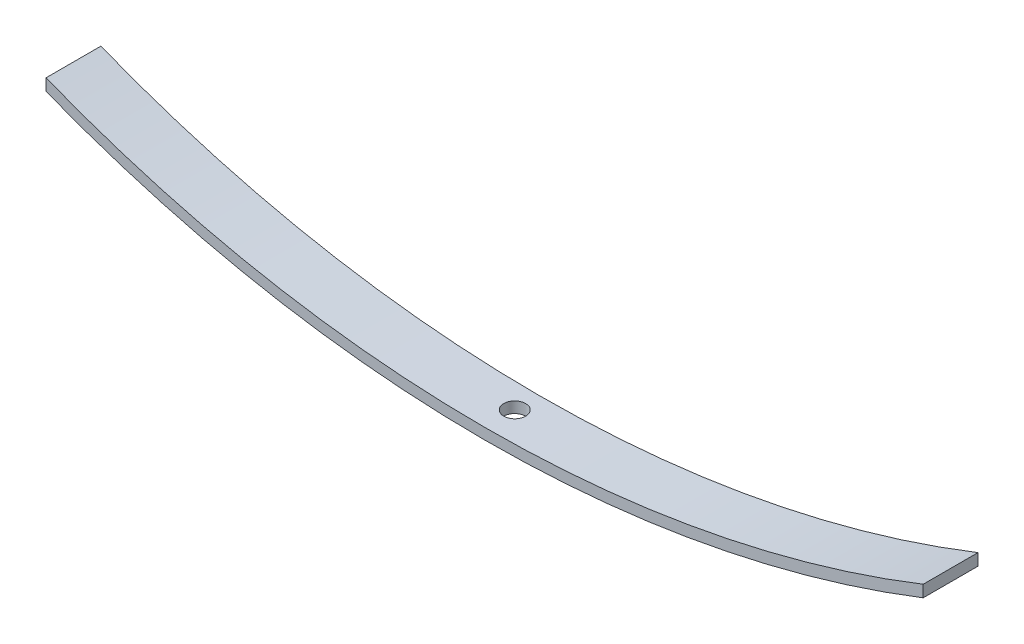
ISO-10303-21;
HEADER;
FILE_DESCRIPTION(('STEP AP214'),'2;1');
FILE_NAME('part.step','',(''),(''),'','','');
FILE_SCHEMA(('AUTOMOTIVE_DESIGN { 1 0 10303 214 1 1 1 1 }'));
ENDSEC;
DATA;
#1=APPLICATION_CONTEXT('core data for automotive mechanical design processes');
#2=APPLICATION_PROTOCOL_DEFINITION('international standard','automotive_design',2000,#1);
#3=PRODUCT_CONTEXT('',#1,'mechanical');
#4=PRODUCT('Part','Part','',(#3));
#5=PRODUCT_RELATED_PRODUCT_CATEGORY('part','',(#4));
#6=PRODUCT_DEFINITION_FORMATION('','',#4);
#7=PRODUCT_DEFINITION_CONTEXT('part definition',#1,'design');
#8=PRODUCT_DEFINITION('design','',#6,#7);
#9=PRODUCT_DEFINITION_SHAPE('','',#8);
#10=(LENGTH_UNIT() NAMED_UNIT(*) SI_UNIT(.MILLI.,.METRE.));
#11=(NAMED_UNIT(*) PLANE_ANGLE_UNIT() SI_UNIT($,.RADIAN.));
#12=(NAMED_UNIT(*) SI_UNIT($,.STERADIAN.) SOLID_ANGLE_UNIT());
#13=UNCERTAINTY_MEASURE_WITH_UNIT(LENGTH_MEASURE(1.E-05),#10,'distance_accuracy_value','');
#14=(GEOMETRIC_REPRESENTATION_CONTEXT(3) GLOBAL_UNCERTAINTY_ASSIGNED_CONTEXT((#13)) GLOBAL_UNIT_ASSIGNED_CONTEXT((#10,
#11,#12)) REPRESENTATION_CONTEXT('',''));
#15=CARTESIAN_POINT('',(0.,0.,0.));
#16=DIRECTION('',(0.,0.,1.));
#17=DIRECTION('',(1.,0.,0.));
#18=AXIS2_PLACEMENT_3D('',#15,#16,#17);
#19=CARTESIAN_POINT('',(-400.,-1024.69507659596,50.));
#20=DIRECTION('',(-1.,0.,0.));
#21=DIRECTION('',(0.,0.,1.));
#22=AXIS2_PLACEMENT_3D('',#19,#20,#21);
#23=PLANE('',#22);
#24=DIRECTION('',(0.,1.,0.));
#25=VECTOR('',#24,1.);
#26=CARTESIAN_POINT('',(-400.,-1024.69507659596,0.));
#27=LINE('',#26,#25);
#28=CARTESIAN_POINT('',(-400.,-1024.69507659596,0.));
#29=VERTEX_POINT('',#28);
#30=CARTESIAN_POINT('',(-400.,-1013.9526616169,0.));
#31=VERTEX_POINT('',#30);
#32=EDGE_CURVE('E117',#29,#31,#27,.T.);
#33=ORIENTED_EDGE('',*,*,#32,.F.);
#34=DIRECTION('',(0.,0.,-1.));
#35=VECTOR('',#34,1.);
#36=CARTESIAN_POINT('',(-400.,-1024.69507659596,50.));
#37=LINE('',#36,#35);
#38=CARTESIAN_POINT('',(-400.,-1024.69507659596,50.));
#39=VERTEX_POINT('',#38);
#40=EDGE_CURVE('E11',#39,#29,#37,.T.);
#41=ORIENTED_EDGE('',*,*,#40,.F.);
#42=DIRECTION('',(0.,1.,0.));
#43=VECTOR('',#42,1.);
#44=CARTESIAN_POINT('',(-400.,-1024.69507659596,50.));
#45=LINE('',#44,#43);
#46=CARTESIAN_POINT('',(-400.,-1013.9526616169,50.));
#47=VERTEX_POINT('',#46);
#48=EDGE_CURVE('E109',#39,#47,#45,.T.);
#49=ORIENTED_EDGE('',*,*,#48,.T.);
#50=DIRECTION('',(0.,0.,-1.));
#51=VECTOR('',#50,1.);
#52=CARTESIAN_POINT('',(-400.,-1013.9526616169,50.));
#53=LINE('',#52,#51);
#54=EDGE_CURVE('E85',#47,#31,#53,.T.);
#55=ORIENTED_EDGE('',*,*,#54,.T.);
#56=EDGE_LOOP('',(#33,#41,#49,#55));
#57=FACE_BOUND('',#56,.T.);
#58=ADVANCED_FACE('F39',(#57),#23,.T.);
#59=CARTESIAN_POINT('',(0.,0.,50.));
#60=DIRECTION('',(0.,0.,-1.));
#61=DIRECTION('',(-1.,0.,0.));
#62=AXIS2_PLACEMENT_3D('',#59,#60,#61);
#63=CYLINDRICAL_SURFACE('',#62,1100.);
#64=CARTESIAN_POINT('',(0.,-1100.,32.5));
#65=CARTESIAN_POINT('',(0.280947064307973,-1100.00000005117,32.5000020216511));
#66=CARTESIAN_POINT('',(0.561860972590403,-1099.99989213973,32.4881554478381));
#67=CARTESIAN_POINT('',(1.12178578051435,-1099.99946361781,32.4408518933722));
#68=CARTESIAN_POINT('',(1.40079616039585,-1099.99914295142,32.405388705864));
#69=CARTESIAN_POINT('',(1.95513034684573,-1099.99829744652,32.3110449823883));
#70=CARTESIAN_POINT('',(2.23044990980033,-1099.99777239089,32.2521395419737));
#71=CARTESIAN_POINT('',(2.7751497667588,-1099.99653304989,32.1113304951339));
#72=CARTESIAN_POINT('',(3.04452995547942,-1099.99581876118,32.0294264813815));
#73=CARTESIAN_POINT('',(3.57529527460837,-1099.99422165126,31.8432499038494));
#74=CARTESIAN_POINT('',(3.83668430405865,-1099.99333891383,31.738988454337));
#75=CARTESIAN_POINT('',(4.34975280879096,-1099.99142972603,31.5088127117588));
#76=CARTESIAN_POINT('',(4.60143213081407,-1099.9904032734,31.3828980770881));
#77=CARTESIAN_POINT('',(5.0932266343026,-1099.9882360755,31.1103460883793));
#78=CARTESIAN_POINT('',(5.33334464279631,-1099.9870953584,30.9637138351722));
#79=CARTESIAN_POINT('',(5.80037129075108,-1099.98473181792,30.6507488257479));
#80=CARTESIAN_POINT('',(6.02728021159513,-1099.9835089963,30.4844164894155));
#81=CARTESIAN_POINT('',(6.46631265262179,-1099.9810157489,30.1332061640088));
#82=CARTESIAN_POINT('',(6.67843408632362,-1099.97974531645,29.9483255667576));
#83=CARTESIAN_POINT('',(7.08634881654811,-1099.97719306931,29.5613522944773));
#84=CARTESIAN_POINT('',(7.2821420962676,-1099.97591125461,29.359259601736));
#85=CARTESIAN_POINT('',(7.65601579250191,-1099.97337257883,28.9392906534728));
#86=CARTESIAN_POINT('',(7.83409551840596,-1099.97211571873,28.7214137831341));
#87=CARTESIAN_POINT('',(8.17126738505734,-1099.96966268322,28.2714323481411));
#88=CARTESIAN_POINT('',(8.33035952943423,-1099.9684665078,28.0393277862065));
#89=CARTESIAN_POINT('',(8.6284250166648,-1099.96616879997,27.5625412338764));
#90=CARTESIAN_POINT('',(8.76739838401762,-1099.96506726744,27.3178592587974));
#91=CARTESIAN_POINT('',(9.02423845245466,-1099.96299011505,26.8176570746719));
#92=CARTESIAN_POINT('',(9.14210515282945,-1099.96201449518,26.5621368652612));
#93=CARTESIAN_POINT('',(9.35589356320991,-1099.96021686752,26.0420753556994));
#94=CARTESIAN_POINT('',(9.45181532069158,-1099.9593948594,25.7775340750661));
#95=CARTESIAN_POINT('',(9.6210320783027,-1099.95792778982,25.2413106724479));
#96=CARTESIAN_POINT('',(9.69432707912008,-1099.95728272837,24.9696285506802));
#97=CARTESIAN_POINT('',(9.81776748787596,-1099.95618788033,24.4210622387808));
#98=CARTESIAN_POINT('',(9.86791350030773,-1099.95573808865,24.1441781846845));
#99=CARTESIAN_POINT('',(9.94470215047097,-1099.95504652537,23.5871696647333));
#100=CARTESIAN_POINT('',(9.97134478860151,-1099.95480475378,23.3070451989335));
#101=CARTESIAN_POINT('',(10.0009371907584,-1099.95453609485,22.7455480448875));
#102=CARTESIAN_POINT('',(10.003887001745,-1099.95450920708,22.4641753591165));
#103=CARTESIAN_POINT('',(9.98607289476243,-1099.95467107818,21.9021817319619));
#104=CARTESIAN_POINT('',(9.965308977192,-1099.95485983704,21.6215607905655));
#105=CARTESIAN_POINT('',(9.90021603221038,-1099.95544763372,21.063073989674));
#106=CARTESIAN_POINT('',(9.85588769419265,-1099.95584666539,20.7852080498216));
#107=CARTESIAN_POINT('',(9.74398155305454,-1099.95684367609,20.2341983398215));
#108=CARTESIAN_POINT('',(9.67640375043628,-1099.95744165513,19.9610545695718));
#109=CARTESIAN_POINT('',(9.51847911119723,-1099.95881958582,19.421430683837));
#110=CARTESIAN_POINT('',(9.42813224886001,-1099.95959953768,19.1549505758786));
#111=CARTESIAN_POINT('',(9.22531191308742,-1099.96131927302,18.6305486862249));
#112=CARTESIAN_POINT('',(9.11283843914294,-1099.9622590565,18.3726269047267));
#113=CARTESIAN_POINT('',(8.86656272873204,-1099.96427179258,17.8671714055499));
#114=CARTESIAN_POINT('',(8.73276017902452,-1099.96534474714,17.6196378405013));
#115=CARTESIAN_POINT('',(8.44477876718316,-1099.96759335706,17.1367223888157));
#116=CARTESIAN_POINT('',(8.29059990492967,-1099.96876901242,16.9013405022501));
#117=CARTESIAN_POINT('',(7.96296196272636,-1099.97118965167,16.4444016228667));
#118=CARTESIAN_POINT('',(7.78950288654837,-1099.97243463555,16.2228446273443));
#119=CARTESIAN_POINT('',(7.42453755271911,-1099.97495859309,15.7951303567988));
#120=CARTESIAN_POINT('',(7.23303129461007,-1099.97623756676,15.5889730821661));
#121=CARTESIAN_POINT('',(6.83332562771209,-1099.97879324704,15.1935164840785));
#122=CARTESIAN_POINT('',(6.62512561226872,-1099.98006995357,15.0042177737951));
#123=CARTESIAN_POINT('',(6.19351853340997,-1099.98258481179,14.6438324390783));
#124=CARTESIAN_POINT('',(5.97011146959816,-1099.98382296348,14.4727458151196));
#125=CARTESIAN_POINT('',(5.50967840926728,-1099.98622556548,14.1500009250355));
#126=CARTESIAN_POINT('',(5.27265241071586,-1099.98739001578,13.9983426618094));
#127=CARTESIAN_POINT('',(4.7866664993514,-1099.98961216017,13.7155327561576));
#128=CARTESIAN_POINT('',(4.5377065866729,-1099.99066985426,13.5843811135007));
#129=CARTESIAN_POINT('',(4.02962249751724,-1099.99264846258,13.3435168404398));
#130=CARTESIAN_POINT('',(3.77049831242723,-1099.99356937668,13.2338042282029));
#131=CARTESIAN_POINT('',(3.24392807012183,-1099.99524828184,13.0365982714823));
#132=CARTESIAN_POINT('',(2.9764820128677,-1099.99600627289,12.9491049271019));
#133=CARTESIAN_POINT('',(2.43516952517331,-1099.99733781424,12.7969596925449));
#134=CARTESIAN_POINT('',(2.16130309631317,-1099.9979113646,12.7323077967468));
#135=CARTESIAN_POINT('',(1.60909695182085,-1099.99885774291,12.6263051983335));
#136=CARTESIAN_POINT('',(1.33075723632501,-1099.99923057088,12.5849544950081));
#137=CARTESIAN_POINT('',(0.771593545451839,-1099.99976491098,12.5258494128803));
#138=CARTESIAN_POINT('',(0.490769659433458,-1099.99992643068,12.5080941887633));
#139=CARTESIAN_POINT('',(-0.0713756577629724,-1100.00003359402,12.4963035779614));
#140=CARTESIAN_POINT('',(-0.352697088929224,-1099.99997923768,12.5022681907142));
#141=CARTESIAN_POINT('',(-0.913837378686011,-1099.99965619194,12.5378748347896));
#142=CARTESIAN_POINT('',(-1.19365623736931,-1099.99938750255,12.5675168646504));
#143=CARTESIAN_POINT('',(-1.74980200235998,-1099.99864341784,12.6502675468223));
#144=CARTESIAN_POINT('',(-2.02612890867426,-1099.99816802251,12.7033761990869));
#145=CARTESIAN_POINT('',(-2.57332170066523,-1099.99702402999,12.832681392134));
#146=CARTESIAN_POINT('',(-2.84418767679329,-1099.996355436,12.9088775501743));
#147=CARTESIAN_POINT('',(-3.37853774997116,-1099.994844021,13.083816268699));
#148=CARTESIAN_POINT('',(-3.64202184713313,-1099.99400119998,13.1825588288409));
#149=CARTESIAN_POINT('',(-4.15973514308947,-1099.99216525379,13.4018882914459));
#150=CARTESIAN_POINT('',(-4.4139643416674,-1099.99117212861,13.52247519442));
#151=CARTESIAN_POINT('',(-4.91136066858346,-1099.98906376295,13.7846360235526));
#152=CARTESIAN_POINT('',(-5.15452779659761,-1099.98794852246,13.9262099503258));
#153=CARTESIAN_POINT('',(-5.62807822212533,-1099.98562754781,14.2293426724206));
#154=CARTESIAN_POINT('',(-5.85846115650697,-1099.98442181108,14.3909020350031));
#155=CARTESIAN_POINT('',(-6.3047980722711,-1099.98195409673,14.7328539213465));
#156=CARTESIAN_POINT('',(-6.52075205340541,-1099.98069211911,14.9132464454312));
#157=CARTESIAN_POINT('',(-6.93669609007042,-1099.97814774351,15.2915824009235));
#158=CARTESIAN_POINT('',(-7.1366861363515,-1099.97686534553,15.4895258425001));
#159=CARTESIAN_POINT('',(-7.5192805340355,-1099.97431653123,15.9015564578257));
#160=CARTESIAN_POINT('',(-7.70188488516435,-1099.97305011491,16.1156436318292));
#161=CARTESIAN_POINT('',(-8.04841491977836,-1099.97056917538,16.5584464198348));
#162=CARTESIAN_POINT('',(-8.21234005256345,-1099.96935465371,16.7871624648145));
#163=CARTESIAN_POINT('',(-8.52034002029632,-1099.96701202092,17.2575914138369));
#164=CARTESIAN_POINT('',(-8.66441485480448,-1099.96588390981,17.4993043181674));
#165=CARTESIAN_POINT('',(-8.93168971938829,-1099.96374612479,17.9940083611056));
#166=CARTESIAN_POINT('',(-9.0548897731304,-1099.96273645075,18.2469994869264));
#167=CARTESIAN_POINT('',(-9.27953928096262,-1099.96086420252,18.7624616538708));
#168=CARTESIAN_POINT('',(-9.38098873558057,-1099.96000162833,19.0249326947644));
#169=CARTESIAN_POINT('',(-9.56141420827453,-1099.95844808083,19.5574843714006));
#170=CARTESIAN_POINT('',(-9.6403905882246,-1099.95775710476,19.8275648845344));
#171=CARTESIAN_POINT('',(-9.77531048728018,-1099.95656635235,20.3734194094439));
#172=CARTESIAN_POINT('',(-9.8312540065221,-1099.95606657601,20.6491934211859));
#173=CARTESIAN_POINT('',(-9.91971041816975,-1099.95527241126,21.2044746995368));
#174=CARTESIAN_POINT('',(-9.95222327318557,-1099.95497802318,21.4839819721024));
#175=CARTESIAN_POINT('',(-9.9935869887929,-1099.95460299441,22.044742053393));
#176=CARTESIAN_POINT('',(-10.0024378499717,-1099.95452235372,22.3259948620747));
#177=CARTESIAN_POINT('',(-9.99641474966445,-1099.95457710805,22.8882356169393));
#178=CARTESIAN_POINT('',(-9.98154168886788,-1099.95471249489,23.1692235727723));
#179=CARTESIAN_POINT('',(-9.92817819983436,-1099.95519544543,23.7289476401099));
#180=CARTESIAN_POINT('',(-9.8896877721794,-1099.95554300913,24.00768375167));
#181=CARTESIAN_POINT('',(-9.78936315775909,-1099.95644044724,24.5609230488737));
#182=CARTESIAN_POINT('',(-9.72752892421368,-1099.95699032205,24.8354262260335));
#183=CARTESIAN_POINT('',(-9.58095639853485,-1099.95827677224,25.378247578608));
#184=CARTESIAN_POINT('',(-9.49621810655042,-1099.95901334763,25.6465657540628));
#185=CARTESIAN_POINT('',(-9.304438217086,-1099.96065230423,26.1751145228585));
#186=CARTESIAN_POINT('',(-9.19739620805113,-1099.96155468852,26.4353449668601));
#187=CARTESIAN_POINT('',(-8.96177089994736,-1099.96349963719,26.9458631765871));
#188=CARTESIAN_POINT('',(-8.8331875967543,-1099.9645422016,27.1961509404087));
#189=CARTESIAN_POINT('',(-8.55539929002957,-1099.96673787208,27.684995049854));
#190=CARTESIAN_POINT('',(-8.40619508437191,-1099.96789097387,27.9235518488939));
#191=CARTESIAN_POINT('',(-8.08822199569385,-1099.97027502198,28.3872485290119));
#192=CARTESIAN_POINT('',(-7.91945313189211,-1099.97150596823,28.6123884232693));
#193=CARTESIAN_POINT('',(-7.56356432748525,-1099.97401066856,29.0476341025049));
#194=CARTESIAN_POINT('',(-7.37644583567259,-1099.97528441926,29.2577410721438));
#195=CARTESIAN_POINT('',(-6.98517229922889,-1099.97783870054,29.6614515965173));
#196=CARTESIAN_POINT('',(-6.78101689079579,-1099.97911923127,29.855054798656));
#197=CARTESIAN_POINT('',(-6.35707164122872,-1099.98165101663,30.2244223053224));
#198=CARTESIAN_POINT('',(-6.13727796443782,-1099.98290226398,30.400182207524));
#199=CARTESIAN_POINT('',(-5.68366731250256,-1099.9853396097,30.7325563312236));
#200=CARTESIAN_POINT('',(-5.44985055868444,-1099.98652570909,30.8891708547745));
#201=CARTESIAN_POINT('',(-4.96972995606513,-1099.98879968479,31.1822187171478));
#202=CARTESIAN_POINT('',(-4.7234197905025,-1099.98988751061,31.3186417076206));
#203=CARTESIAN_POINT('',(-4.22018163412486,-1099.99193332191,31.5702373393554));
#204=CARTESIAN_POINT('',(-3.96325383145126,-1099.99289130968,31.6854103569634));
#205=CARTESIAN_POINT('',(-3.44087746622745,-1099.99464930056,31.8935788467592));
#206=CARTESIAN_POINT('',(-3.17543826339022,-1099.99544947072,31.9865977921384));
#207=CARTESIAN_POINT('',(-2.63775802567634,-1099.99687023153,32.1499313837608));
#208=CARTESIAN_POINT('',(-2.36551879736234,-1099.99749086934,32.2202519925835));
#209=CARTESIAN_POINT('',(-1.7475100578521,-1099.99866540734,32.3523789407716));
#210=CARTESIAN_POINT('',(-1.40033267948958,-1099.99916407617,32.4076898095124));
#211=CARTESIAN_POINT('',(-0.702086281630147,-1099.99983134053,32.4814990757067));
#212=CARTESIAN_POINT('',(-0.351017262236259,-1099.99999993607,32.4999974741347));
#213=CARTESIAN_POINT('',(0.,-1100.,32.5));
#214=B_SPLINE_CURVE_WITH_KNOTS('',3,(#64,#65,#66,#67,#68,#69,#70,#71,#72,#73,#74,#75,#76,#77,
#78,#79,#80,#81,#82,#83,#84,#85,#86,#87,#88,#89,#90,#91,#92,#93,#94,#95,#96,#97,#98,#99,#100,
#101,#102,#103,#104,#105,#106,#107,#108,#109,#110,#111,#112,#113,#114,#115,#116,#117,#118,#119,
#120,#121,#122,#123,#124,#125,#126,#127,#128,#129,#130,#131,#132,#133,#134,#135,#136,#137,#138,
#139,#140,#141,#142,#143,#144,#145,#146,#147,#148,#149,#150,#151,#152,#153,#154,#155,#156,#157,
#158,#159,#160,#161,#162,#163,#164,#165,#166,#167,#168,#169,#170,#171,#172,#173,#174,#175,#176,
#177,#178,#179,#180,#181,#182,#183,#184,#185,#186,#187,#188,#189,#190,#191,#192,#193,#194,#195,
#196,#197,#198,#199,#200,#201,#202,#203,#204,#205,#206,#207,#208,#209,#210,#211,#212,#213),
.UNSPECIFIED.,.T.,.F.,(4,2,2,2,2,2,2,2,2,2,2,2,2,2,2,2,2,2,2,2,2,2,2,2,2,2,2,2,2,2,2,2,2,2,2,2,
2,2,2,2,2,2,2,2,2,2,2,2,2,2,2,2,2,2,2,2,2,2,2,2,2,2,2,2,2,2,2,2,2,2,2,2,2,2,4),(0.,
0.842534577510601,1.68529067514222,2.5289444955584,3.37261325884719,4.21586358809915,
5.0591272218507,5.90218359847124,6.74522200953625,7.58837913164906,8.43153712143766,
9.27472797114516,10.1179186596733,10.9611083214188,11.8042980115051,12.6474858774049,
13.4906737176693,14.3338395383882,15.1770053447907,16.020169479999,16.8633336010304,
17.7064730560677,18.5496124928953,19.3927528820083,20.2358932905217,21.079046082627,
21.9221988796832,22.7653515117916,23.6085041652863,24.4516874730138,25.2948708027221,
26.1380542582581,26.9812377042883,27.8244218648185,28.667606029274,29.5107899862167,
30.3539739174617,31.1971276405931,32.0402813437306,32.8834349948124,33.7265886442239,
34.5697283166834,35.4128679763346,36.2560076557052,37.0991473597693,37.9423110007654,
38.7854746562632,39.6286388002934,40.4718029576155,41.314991966646,42.15818099435,
43.001369066095,43.8445571173779,44.6877315904048,45.5309060584382,46.3740818719793,
47.2172576645916,48.0604014464112,48.9035452074536,49.7466906581313,50.5898361033245,
51.4329971078685,52.2761582738391,53.1192868249362,53.9624145478228,54.8054757551859,
55.6485549696765,56.491841687007,57.3351150982441,58.1788192094785,59.0225083769307,
59.865299602535,60.7078692565258,61.7605379836224,62.813206682851),.UNSPECIFIED.);
#215=CARTESIAN_POINT('',(0.,-1100.,32.5));
#216=VERTEX_POINT('',#215);
#217=EDGE_CURVE('E122',#216,#216,#214,.T.);
#218=ORIENTED_EDGE('',*,*,#217,.T.);
#219=EDGE_LOOP('',(#218));
#220=FACE_BOUND('',#219,.T.);
#221=CARTESIAN_POINT('',(0.,0.,0.));
#222=DIRECTION('',(0.,0.,1.));
#223=DIRECTION('',(1.,0.,0.));
#224=AXIS2_PLACEMENT_3D('',#221,#222,#223);
#225=CIRCLE('',#224,1100.);
#226=CARTESIAN_POINT('',(400.,-1024.69507659596,0.));
#227=VERTEX_POINT('',#226);
#228=EDGE_CURVE('E77',#29,#227,#225,.T.);
#229=ORIENTED_EDGE('',*,*,#228,.T.);
#230=DIRECTION('',(0.,0.,-1.));
#231=VECTOR('',#230,1.);
#232=CARTESIAN_POINT('',(400.,-1024.69507659596,50.));
#233=LINE('',#232,#231);
#234=CARTESIAN_POINT('',(400.,-1024.69507659596,50.));
#235=VERTEX_POINT('',#234);
#236=EDGE_CURVE('E53',#235,#227,#233,.T.);
#237=ORIENTED_EDGE('',*,*,#236,.F.);
#238=CARTESIAN_POINT('',(0.,0.,50.));
#239=DIRECTION('',(0.,0.,1.));
#240=DIRECTION('',(1.,0.,0.));
#241=AXIS2_PLACEMENT_3D('',#238,#239,#240);
#242=CIRCLE('',#241,1100.);
#243=EDGE_CURVE('E95',#39,#235,#242,.T.);
#244=ORIENTED_EDGE('',*,*,#243,.F.);
#245=ORIENTED_EDGE('',*,*,#40,.T.);
#246=EDGE_LOOP('',(#229,#237,#244,#245));
#247=FACE_BOUND('',#246,.T.);
#248=ADVANCED_FACE('F144',(#220,#247),#63,.T.);
#249=CARTESIAN_POINT('',(400.,-1024.69507659596,50.));
#250=DIRECTION('',(-1.,0.,0.));
#251=DIRECTION('',(0.,0.,1.));
#252=AXIS2_PLACEMENT_3D('',#249,#250,#251);
#253=PLANE('',#252);
#254=DIRECTION('',(0.,1.,0.));
#255=VECTOR('',#254,1.);
#256=CARTESIAN_POINT('',(400.,-1024.69507659596,0.));
#257=LINE('',#256,#255);
#258=CARTESIAN_POINT('',(400.,-1013.9526616169,0.));
#259=VERTEX_POINT('',#258);
#260=EDGE_CURVE('E103',#227,#259,#257,.T.);
#261=ORIENTED_EDGE('',*,*,#260,.T.);
#262=DIRECTION('',(0.,0.,-1.));
#263=VECTOR('',#262,1.);
#264=CARTESIAN_POINT('',(400.,-1013.9526616169,50.));
#265=LINE('',#264,#263);
#266=CARTESIAN_POINT('',(400.,-1013.9526616169,50.));
#267=VERTEX_POINT('',#266);
#268=EDGE_CURVE('E100',#267,#259,#265,.T.);
#269=ORIENTED_EDGE('',*,*,#268,.F.);
#270=DIRECTION('',(0.,1.,0.));
#271=VECTOR('',#270,1.);
#272=CARTESIAN_POINT('',(400.,-1024.69507659596,50.));
#273=LINE('',#272,#271);
#274=EDGE_CURVE('E90',#235,#267,#273,.T.);
#275=ORIENTED_EDGE('',*,*,#274,.F.);
#276=ORIENTED_EDGE('',*,*,#236,.T.);
#277=EDGE_LOOP('',(#261,#269,#275,#276));
#278=FACE_BOUND('',#277,.T.);
#279=ADVANCED_FACE('F101',(#278),#253,.F.);
#280=CARTESIAN_POINT('',(0.,0.,50.));
#281=DIRECTION('',(0.,0.,-1.));
#282=DIRECTION('',(-1.,0.,0.));
#283=AXIS2_PLACEMENT_3D('',#280,#281,#282);
#284=CYLINDRICAL_SURFACE('',#283,1090.);
#285=CARTESIAN_POINT('',(0.,-1090.,32.5));
#286=CARTESIAN_POINT('',(0.280946949255818,-1090.00000005164,32.5000020217571));
#287=CARTESIAN_POINT('',(0.561860741123266,-1089.99989115028,32.4881554575975));
#288=CARTESIAN_POINT('',(1.12178531539269,-1089.99945869732,32.4408519424622));
#289=CARTESIAN_POINT('',(1.40079557804169,-1089.9991350893,32.4053887847198));
#290=CARTESIAN_POINT('',(1.95512952521304,-1089.99828182818,32.3110451425045));
#291=CARTESIAN_POINT('',(2.23044896617793,-1089.99775195597,32.2521397539417));
#292=CARTESIAN_POINT('',(2.77514857991336,-1089.99650124591,32.1113308339074));
#293=CARTESIAN_POINT('',(3.04452864739896,-1089.99578040467,32.0294268951026));
#294=CARTESIAN_POINT('',(3.57529372158464,-1089.99416864368,31.8432504936959));
#295=CARTESIAN_POINT('',(3.83668262748439,-1089.99327780846,31.738989145803));
#296=CARTESIAN_POINT('',(4.34975089181955,-1089.99135110667,31.5088136324503));
#297=CARTESIAN_POINT('',(4.60143009699863,-1089.99031523783,31.3828991253916));
#298=CARTESIAN_POINT('',(5.09322437995995,-1089.98812815894,31.1103474165484));
#299=CARTESIAN_POINT('',(5.33334228468784,-1089.98697697731,30.9637153154447));
#300=CARTESIAN_POINT('',(5.80036874175077,-1089.98459175444,30.6507506338357));
#301=CARTESIAN_POINT('',(6.02727757546075,-1089.98335771496,30.4844184732034));
#302=CARTESIAN_POINT('',(6.46630996870125,-1089.98084159435,30.1332084360916));
#303=CARTESIAN_POINT('',(6.67843143470212,-1089.97955950646,29.9483279426227));
#304=CARTESIAN_POINT('',(7.08634624025277,-1089.97698384379,29.5613548781375));
#305=CARTESIAN_POINT('',(7.28213956299467,-1089.97569026899,29.359262289404));
#306=CARTESIAN_POINT('',(7.65601335831125,-1089.97312830169,28.9392935457158));
#307=CARTESIAN_POINT('',(7.83409314025974,-1089.97185991018,28.72141677593));
#308=CARTESIAN_POINT('',(8.17126513290176,-1089.96938436834,28.2714355348317));
#309=CARTESIAN_POINT('',(8.33035734722321,-1089.968177218,28.0393310662378));
#310=CARTESIAN_POINT('',(8.62842303576405,-1089.96585842802,27.5625446131695));
#311=CARTESIAN_POINT('',(8.76739652804651,-1089.96474678829,27.3178626399878));
#312=CARTESIAN_POINT('',(9.02423684482445,-1089.96265057657,26.8176604389248));
#313=CARTESIAN_POINT('',(9.14210366860459,-1089.96166600458,26.5621402106761));
#314=CARTESIAN_POINT('',(9.3558923208138,-1089.95985188196,26.0420786430565));
#315=CARTESIAN_POINT('',(9.45181419677565,-1089.95902233099,25.7775373232266));
#316=CARTESIAN_POINT('',(9.62103118317025,-1089.95754179919,25.2413138223556));
#317=CARTESIAN_POINT('',(9.69432629430312,-1089.95689081835,24.9696316415355));
#318=CARTESIAN_POINT('',(9.81776688023936,-1089.95578592353,24.4210653359419));
#319=CARTESIAN_POINT('',(9.86791297149303,-1089.95533200429,24.1441813498951));
#320=CARTESIAN_POINT('',(9.94470178936064,-1089.95463409439,23.5871729548416));
#321=CARTESIAN_POINT('',(9.9713445163809,-1089.95439010371,23.3070485458908));
#322=CARTESIAN_POINT('',(10.0009371046529,-1089.95411897811,22.7455514969161));
#323=CARTESIAN_POINT('',(10.0038870129425,-1089.95409184275,22.4641788593715));
#324=CARTESIAN_POINT('',(9.98607310828695,-1089.95425519718,21.9021853212034));
#325=CARTESIAN_POINT('',(9.9653092957474,-1089.95444568696,21.6215644205671));
#326=CARTESIAN_POINT('',(9.90021658646461,-1089.95503887459,21.0630778482745));
#327=CARTESIAN_POINT('',(9.85588839198566,-1089.95544156612,20.7852120947608));
#328=CARTESIAN_POINT('',(9.74398257180963,-1089.95644772165,20.2342027469271));
#329=CARTESIAN_POINT('',(9.6764049466245,-1089.95705118566,19.9610591525032));
#330=CARTESIAN_POINT('',(9.51848069630313,-1089.95844175566,19.4214356045147));
#331=CARTESIAN_POINT('',(9.42813404541992,-1089.95922886188,19.1549556584857));
#332=CARTESIAN_POINT('',(9.22531416648292,-1089.96096437222,18.6305540749841));
#333=CARTESIAN_POINT('',(9.11284093791083,-1089.96191277635,18.3726324377119));
#334=CARTESIAN_POINT('',(8.8665657170461,-1089.96394397574,17.8671771342375));
#335=CARTESIAN_POINT('',(8.73276340561166,-1089.96502677301,17.6196436235403));
#336=CARTESIAN_POINT('',(8.44478248990456,-1089.96729601066,17.1367282590672));
#337=CARTESIAN_POINT('',(8.29060388550976,-1089.96848245104,16.9013464053641));
#338=CARTESIAN_POINT('',(7.96296647509361,-1089.97092529654,16.4444075644151));
#339=CARTESIAN_POINT('',(7.78950767276966,-1089.97218170164,16.222850574518));
#340=CARTESIAN_POINT('',(7.42454289888065,-1089.97472881367,15.7951362840903));
#341=CARTESIAN_POINT('',(7.23303692684935,-1089.97601952059,15.5889789839575));
#342=CARTESIAN_POINT('',(6.83333170524337,-1089.97859864775,15.1935221675746));
#343=CARTESIAN_POINT('',(6.62513183787351,-1089.9798870679,15.0042232757556));
#344=CARTESIAN_POINT('',(6.19352503604483,-1089.9824249999,14.6438375650129));
#345=CARTESIAN_POINT('',(5.97011810118236,-1089.98367451175,14.4727507465725));
#346=CARTESIAN_POINT('',(5.50968527604719,-1089.98609915819,14.1500054553963));
#347=CARTESIAN_POINT('',(5.27265938373751,-1089.98727429276,13.9983469855663));
#348=CARTESIAN_POINT('',(4.78667365916422,-1089.98951682652,13.7155366567325));
#349=CARTESIAN_POINT('',(4.53771382703763,-1089.99058422571,13.5843847974931));
#350=CARTESIAN_POINT('',(4.02962986686288,-1089.99258098957,13.3435200823891));
#351=CARTESIAN_POINT('',(3.7705057300341,-1089.99351035413,13.2338072450454));
#352=CARTESIAN_POINT('',(3.24393555519605,-1089.99520466562,13.0366008358534));
#353=CARTESIAN_POINT('',(2.9764895171473,-1089.99596961256,12.9491072641105));
#354=CARTESIAN_POINT('',(2.4351770406149,-1089.99731337367,12.796961577095));
#355=CARTESIAN_POINT('',(2.16131060373515,-1089.99789218789,12.7323094561163));
#356=CARTESIAN_POINT('',(1.609104417337,-1089.99884725247,12.6263064132051));
#357=CARTESIAN_POINT('',(1.33076466795745,-1089.99922350283,12.5849554905493));
#358=CARTESIAN_POINT('',(0.771601071663803,-1089.99976274883,12.5258499984362));
#359=CARTESIAN_POINT('',(0.490777315756461,-1089.99992575225,12.5080945680838));
#360=CARTESIAN_POINT('',(-0.0713677599589869,-1090.00003390271,12.4963035248841));
#361=CARTESIAN_POINT('',(-0.352689079755075,-1089.99997904976,12.502267911464));
#362=CARTESIAN_POINT('',(-0.913829164393338,-1089.99965304459,12.5378740846012));
#363=CARTESIAN_POINT('',(-1.19364792933124,-1089.99938189238,12.5675158696501));
#364=CARTESIAN_POINT('',(-1.74979352470412,-1089.9986309857,12.6502660442336));
#365=CARTESIAN_POINT('',(-2.02612035514615,-1089.99815123123,12.703374433721));
#366=CARTESIAN_POINT('',(-2.57331292970767,-1089.99699674811,12.8326790636244));
#367=CARTESIAN_POINT('',(-2.84417876595023,-1089.99632202275,12.9088749142234));
#368=CARTESIAN_POINT('',(-3.37852858406516,-1089.9947967466,13.0838129865853));
#369=CARTESIAN_POINT('',(-3.64201256605172,-1089.99394619581,13.1825552079996));
#370=CARTESIAN_POINT('',(-4.1597256614019,-1089.99209341103,13.4018839634433));
#371=CARTESIAN_POINT('',(-4.41395477452278,-1089.99109117704,13.5224704980457));
#372=CARTESIAN_POINT('',(-4.9113509647269,-1089.9889634732,13.7846305628455));
#373=CARTESIAN_POINT('',(-5.15451804148014,-1089.98783800336,13.9262040936689));
#374=CARTESIAN_POINT('',(-5.62806852887217,-1089.98549573879,14.2293360796426));
#375=CARTESIAN_POINT('',(-5.85845156965581,-1089.98427894143,14.3908951125576));
#376=CARTESIAN_POINT('',(-6.3047887277986,-1089.98178858932,14.732846339964));
#377=CARTESIAN_POINT('',(-6.52074284490505,-1089.98051503456,14.9132385347853));
#378=CARTESIAN_POINT('',(-6.93668718665554,-1089.97794731676,15.2915738372847));
#379=CARTESIAN_POINT('',(-7.13667740199866,-1089.97665315371,15.4895169551883));
#380=CARTESIAN_POINT('',(-7.51927217228812,-1089.97408095523,15.9015469337131));
#381=CARTESIAN_POINT('',(-7.70187672695557,-1089.97280291981,16.1156337945933));
#382=CARTESIAN_POINT('',(-8.04840729716924,-1089.97029921684,16.5584360920453));
#383=CARTESIAN_POINT('',(-8.21233275197561,-1089.96907355087,16.7871519674533));
#384=CARTESIAN_POINT('',(-8.52033337658329,-1089.9667094217,17.2575806131645));
#385=CARTESIAN_POINT('',(-8.6644085459367,-1089.96557095852,17.4992933837611));
#386=CARTESIAN_POINT('',(-8.93168408921589,-1089.96341355551,17.9939971973533));
#387=CARTESIAN_POINT('',(-9.05488448683779,-1089.96239461555,18.246988227546));
#388=CARTESIAN_POINT('',(-9.27953468709267,-1089.96050518471,18.7624502430863));
#389=CARTESIAN_POINT('',(-9.38098449026269,-1089.95963469383,19.0249212281998));
#390=CARTESIAN_POINT('',(-9.56141063351606,-1089.95806688735,19.557472755951));
#391=CARTESIAN_POINT('',(-9.64038734198486,-1089.95736956891,19.827553173773));
#392=CARTESIAN_POINT('',(-9.77530790602104,-1089.95616788574,20.3734075435621));
#393=CARTESIAN_POINT('',(-9.83125176172786,-1089.95566352102,20.6491814954946));
#394=CARTESIAN_POINT('',(-9.91970884961662,-1089.95486206379,21.2044626871956));
#395=CARTESIAN_POINT('',(-9.95222204449882,-1089.95456497161,21.4839699329063));
#396=CARTESIAN_POINT('',(-9.9935864397056,-1089.95418649574,22.0447299918408));
#397=CARTESIAN_POINT('',(-10.0024376406285,-1089.95410511204,22.3259828050204));
#398=CARTESIAN_POINT('',(-9.99641521891254,-1089.95416036252,22.8882234099835));
#399=CARTESIAN_POINT('',(-9.98154251273149,-1089.95429698829,23.1692112115849));
#400=CARTESIAN_POINT('',(-9.92817975960635,-1089.95478436328,23.728934999426));
#401=CARTESIAN_POINT('',(-9.88968971325547,-1089.95513511249,24.0076709857223));
#402=CARTESIAN_POINT('',(-9.78936588664306,-1089.95604077774,24.5609100622718));
#403=CARTESIAN_POINT('',(-9.72753205960976,-1089.9565956942,24.8354131440428));
#404=CARTESIAN_POINT('',(-9.58096037085348,-1089.95789394068,25.3782343375907));
#405=CARTESIAN_POINT('',(-9.49622250927445,-1089.9586372707,25.6465524494064));
#406=CARTESIAN_POINT('',(-9.30444350327033,-1089.96029125795,26.1751011246744));
#407=CARTESIAN_POINT('',(-9.19740194734273,-1089.96120191827,26.4353315388071));
#408=CARTESIAN_POINT('',(-8.961777565838,-1089.96316470536,26.9458497268664));
#409=CARTESIAN_POINT('',(-8.83319473613844,-1089.96421683216,27.1961374988903));
#410=CARTESIAN_POINT('',(-8.55540739290553,-1089.96643264194,27.6849816683865));
#411=CARTESIAN_POINT('',(-8.40620367715405,-1089.9675963206,27.9235385192214));
#412=CARTESIAN_POINT('',(-8.08823158063009,-1089.97000223711,28.3872353502699));
#413=CARTESIAN_POINT('',(-7.91946321906504,-1089.97124447487,28.6123753436552));
#414=CARTESIAN_POINT('',(-7.56357530694252,-1089.97377215238,29.0476214179025));
#415=CARTESIAN_POINT('',(-7.37645719296149,-1089.97505758873,29.2577286734326));
#416=CARTESIAN_POINT('',(-6.98518438942205,-1089.97763530418,29.6614398024208));
#417=CARTESIAN_POINT('',(-6.78102933605569,-1089.97892758342,29.8550433232785));
#418=CARTESIAN_POINT('',(-6.35708476900277,-1089.98148259787,30.2244114999963));
#419=CARTESIAN_POINT('',(-6.13729141967878,-1089.98274532573,30.4001717535689));
#420=CARTESIAN_POINT('',(-5.68368138911748,-1089.98520503543,30.7325466117194));
#421=CARTESIAN_POINT('',(-5.44986492920373,-1089.98640201831,30.8891615183454));
#422=CARTESIAN_POINT('',(-4.96974480653381,-1089.9886968608,31.1822102184141));
#423=CARTESIAN_POINT('',(-4.72343482342935,-1089.98979466944,31.3186336576784));
#424=CARTESIAN_POINT('',(-4.2201969834484,-1089.99185925568,31.5702301995636));
#425=CARTESIAN_POINT('',(-3.96326931471729,-1089.99282603559,31.6854036785364));
#426=CARTESIAN_POINT('',(-3.44089316436403,-1089.99460016175,31.8935730986887));
#427=CARTESIAN_POINT('',(-3.1754540424175,-1089.99540767659,31.9865925128244));
#428=CARTESIAN_POINT('',(-2.63777391675605,-1089.99684147951,32.1499270424641));
#429=CARTESIAN_POINT('',(-2.36553471959881,-1089.99746781518,32.2202481204886));
#430=CARTESIAN_POINT('',(-1.7475234598838,-1089.99865314267,32.3523766598995));
#431=CARTESIAN_POINT('',(-1.40034345822622,-1089.99915639415,32.4076883823329));
#432=CARTESIAN_POINT('',(-0.702091717599629,-1089.99982979055,32.4814987888777));
#433=CARTESIAN_POINT('',(-0.351019978735542,-1089.99999993548,32.4999974739817));
#434=CARTESIAN_POINT('',(0.,-1090.,32.5));
#435=B_SPLINE_CURVE_WITH_KNOTS('',3,(#285,#286,#287,#288,#289,#290,#291,#292,#293,#294,#295,
#296,#297,#298,#299,#300,#301,#302,#303,#304,#305,#306,#307,#308,#309,#310,#311,#312,#313,#314,
#315,#316,#317,#318,#319,#320,#321,#322,#323,#324,#325,#326,#327,#328,#329,#330,#331,#332,#333,
#334,#335,#336,#337,#338,#339,#340,#341,#342,#343,#344,#345,#346,#347,#348,#349,#350,#351,#352,
#353,#354,#355,#356,#357,#358,#359,#360,#361,#362,#363,#364,#365,#366,#367,#368,#369,#370,#371,
#372,#373,#374,#375,#376,#377,#378,#379,#380,#381,#382,#383,#384,#385,#386,#387,#388,#389,#390,
#391,#392,#393,#394,#395,#396,#397,#398,#399,#400,#401,#402,#403,#404,#405,#406,#407,#408,#409,
#410,#411,#412,#413,#414,#415,#416,#417,#418,#419,#420,#421,#422,#423,#424,#425,#426,#427,#428,
#429,#430,#431,#432,#433,#434),.UNSPECIFIED.,.T.,.F.,(4,2,2,2,2,2,2,2,2,2,2,2,2,2,2,2,2,2,2,2,2,
2,2,2,2,2,2,2,2,2,2,2,2,2,2,2,2,2,2,2,2,2,2,2,2,2,2,2,2,2,2,2,2,2,2,2,2,2,2,2,2,2,2,2,2,2,2,2,2,
2,2,2,2,2,4),(0.,0.842534229930871,1.68528997692023,2.52894343425277,3.37261183469372,
4.21586178419734,5.05912503798046,5.90218104057923,6.74521907812124,7.58837622785525,
8.43153424550861,9.27472512383923,10.1179158410625,10.9611058012437,11.8042957900016,
12.6474839523909,13.4906720886899,14.3338377698888,15.1770034365117,16.02016742918,
16.8633314074291,17.7064702591644,18.5496090923338,19.3927488789197,20.2358886852556,
21.0790411084688,21.9221935367356,22.7653458033095,23.6084980916657,24.4516815971845,
25.2948651250856,26.1380487791017,26.9812324234363,27.8244167961858,28.6676011729343,
29.5107853390454,30.3539694789854,31.1971228540247,32.0402762087011,32.8834295096616,
33.7265828089197,34.5697218728609,35.4128609237582,36.2559999967694,37.0991390949331,
37.9423025732634,38.7854660663608,39.6286300507006,40.4717940485662,41.3149833512463,
42.1581726729522,43.0013610375006,43.8445493812303,44.6877239023774,45.5308984184201,
46.374074276727,47.2172501137147,48.0603933794944,48.9035366240959,49.7466815580337,
50.5898264866724,51.4329869726882,52.2761476200631,53.1192756563229,53.962402864856,
54.805464118756,55.648543380051,56.4918301427687,57.3351035995839,58.1788079995685,
59.0224974555184,59.8652889780247,60.7078589310311,61.7605358019913,62.8132126445685),.UNSPECIFIED.);
#436=CARTESIAN_POINT('',(0.,-1090.,32.5));
#437=VERTEX_POINT('',#436);
#438=EDGE_CURVE('E42',#437,#437,#435,.T.);
#439=ORIENTED_EDGE('',*,*,#438,.F.);
#440=EDGE_LOOP('',(#439));
#441=FACE_BOUND('',#440,.T.);
#442=CARTESIAN_POINT('',(0.,0.,0.));
#443=DIRECTION('',(0.,0.,1.));
#444=DIRECTION('',(1.,0.,0.));
#445=AXIS2_PLACEMENT_3D('',#442,#443,#444);
#446=CIRCLE('',#445,1090.);
#447=EDGE_CURVE('E121',#31,#259,#446,.T.);
#448=ORIENTED_EDGE('',*,*,#447,.F.);
#449=ORIENTED_EDGE('',*,*,#54,.F.);
#450=CARTESIAN_POINT('',(0.,0.,50.));
#451=DIRECTION('',(0.,0.,1.));
#452=DIRECTION('',(1.,0.,0.));
#453=AXIS2_PLACEMENT_3D('',#450,#451,#452);
#454=CIRCLE('',#453,1090.);
#455=EDGE_CURVE('E94',#47,#267,#454,.T.);
#456=ORIENTED_EDGE('',*,*,#455,.T.);
#457=ORIENTED_EDGE('',*,*,#268,.T.);
#458=EDGE_LOOP('',(#448,#449,#456,#457));
#459=FACE_BOUND('',#458,.T.);
#460=ADVANCED_FACE('F107',(#441,#459),#284,.F.);
#461=CARTESIAN_POINT('',(0.,0.,50.));
#462=DIRECTION('',(0.,0.,1.));
#463=DIRECTION('',(1.,0.,0.));
#464=AXIS2_PLACEMENT_3D('',#461,#462,#463);
#465=PLANE('',#464);
#466=ORIENTED_EDGE('',*,*,#48,.F.);
#467=ORIENTED_EDGE('',*,*,#243,.T.);
#468=ORIENTED_EDGE('',*,*,#274,.T.);
#469=ORIENTED_EDGE('',*,*,#455,.F.);
#470=EDGE_LOOP('',(#466,#467,#468,#469));
#471=FACE_BOUND('',#470,.T.);
#472=ADVANCED_FACE('F93',(#471),#465,.T.);
#473=CARTESIAN_POINT('',(0.,0.,0.));
#474=DIRECTION('',(0.,0.,1.));
#475=DIRECTION('',(1.,0.,0.));
#476=AXIS2_PLACEMENT_3D('',#473,#474,#475);
#477=PLANE('',#476);
#478=ORIENTED_EDGE('',*,*,#32,.T.);
#479=ORIENTED_EDGE('',*,*,#447,.T.);
#480=ORIENTED_EDGE('',*,*,#260,.F.);
#481=ORIENTED_EDGE('',*,*,#228,.F.);
#482=EDGE_LOOP('',(#478,#479,#480,#481));
#483=FACE_BOUND('',#482,.T.);
#484=ADVANCED_FACE('F132',(#483),#477,.F.);
#485=CARTESIAN_POINT('',(0.,-1100.,22.5));
#486=DIRECTION('',(0.,1.,0.));
#487=DIRECTION('',(0.,0.,1.));
#488=AXIS2_PLACEMENT_3D('',#485,#486,#487);
#489=CYLINDRICAL_SURFACE('',#488,10.);
#490=ORIENTED_EDGE('',*,*,#438,.T.);
#491=EDGE_LOOP('',(#490));
#492=FACE_BOUND('',#491,.T.);
#493=ORIENTED_EDGE('',*,*,#217,.F.);
#494=EDGE_LOOP('',(#493));
#495=FACE_BOUND('',#494,.T.);
#496=ADVANCED_FACE('F134',(#492,#495),#489,.F.);
#497=CLOSED_SHELL('',(#58,#248,#279,#460,#472,#484,#496));
#498=MANIFOLD_SOLID_BREP('B2',#497);
#499=ADVANCED_BREP_SHAPE_REPRESENTATION('',(#18,#498),#14);
#500=SHAPE_DEFINITION_REPRESENTATION(#9,#499);
ENDSEC;
END-ISO-10303-21;
